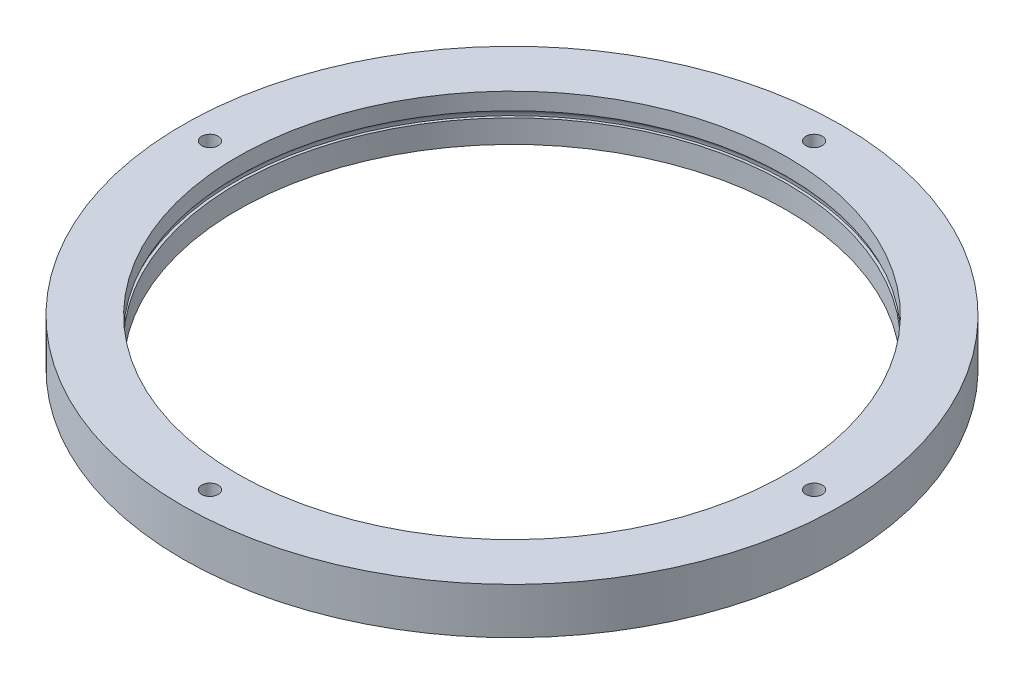
ISO-10303-21;
HEADER;
FILE_DESCRIPTION(('STEP AP214'),'2;1');
FILE_NAME('part.step','',(''),(''),'','','');
FILE_SCHEMA(('AUTOMOTIVE_DESIGN { 1 0 10303 214 1 1 1 1 }'));
ENDSEC;
DATA;
#1=APPLICATION_CONTEXT('core data for automotive mechanical design processes');
#2=APPLICATION_PROTOCOL_DEFINITION('international standard','automotive_design',2000,#1);
#3=PRODUCT_CONTEXT('',#1,'mechanical');
#4=PRODUCT('Part','Part','',(#3));
#5=PRODUCT_RELATED_PRODUCT_CATEGORY('part','',(#4));
#6=PRODUCT_DEFINITION_FORMATION('','',#4);
#7=PRODUCT_DEFINITION_CONTEXT('part definition',#1,'design');
#8=PRODUCT_DEFINITION('design','',#6,#7);
#9=PRODUCT_DEFINITION_SHAPE('','',#8);
#10=(LENGTH_UNIT() NAMED_UNIT(*) SI_UNIT(.MILLI.,.METRE.));
#11=(NAMED_UNIT(*) PLANE_ANGLE_UNIT() SI_UNIT($,.RADIAN.));
#12=(NAMED_UNIT(*) SI_UNIT($,.STERADIAN.) SOLID_ANGLE_UNIT());
#13=UNCERTAINTY_MEASURE_WITH_UNIT(LENGTH_MEASURE(1.E-05),#10,'distance_accuracy_value','');
#14=(GEOMETRIC_REPRESENTATION_CONTEXT(3) GLOBAL_UNCERTAINTY_ASSIGNED_CONTEXT((#13)) GLOBAL_UNIT_ASSIGNED_CONTEXT((#10,
#11,#12)) REPRESENTATION_CONTEXT('',''));
#15=CARTESIAN_POINT('',(0.,0.,0.));
#16=DIRECTION('',(0.,0.,1.));
#17=DIRECTION('',(1.,0.,0.));
#18=AXIS2_PLACEMENT_3D('',#15,#16,#17);
#19=CARTESIAN_POINT('',(0.,8.4,0.));
#20=DIRECTION('',(0.,-1.,0.));
#21=DIRECTION('',(0.,0.,-1.));
#22=AXIS2_PLACEMENT_3D('',#19,#20,#21);
#23=CYLINDRICAL_SURFACE('',#22,50.);
#24=CARTESIAN_POINT('',(0.,8.4,0.));
#25=DIRECTION('',(0.,1.,0.));
#26=DIRECTION('',(0.,0.,1.));
#27=AXIS2_PLACEMENT_3D('',#24,#25,#26);
#28=CIRCLE('',#27,50.);
#29=CARTESIAN_POINT('',(0.,8.4,50.));
#30=VERTEX_POINT('',#29);
#31=EDGE_CURVE('E64',#30,#30,#28,.T.);
#32=ORIENTED_EDGE('',*,*,#31,.T.);
#33=EDGE_LOOP('',(#32));
#34=FACE_BOUND('',#33,.T.);
#35=CARTESIAN_POINT('',(0.,5.30297838823083,0.));
#36=DIRECTION('',(0.,1.,0.));
#37=DIRECTION('',(0.,0.,1.));
#38=AXIS2_PLACEMENT_3D('',#35,#36,#37);
#39=CIRCLE('',#38,50.);
#40=CARTESIAN_POINT('',(0.,5.30297838823083,50.));
#41=VERTEX_POINT('',#40);
#42=EDGE_CURVE('E85',#41,#41,#39,.T.);
#43=ORIENTED_EDGE('',*,*,#42,.F.);
#44=EDGE_LOOP('',(#43));
#45=FACE_BOUND('',#44,.T.);
#46=ADVANCED_FACE('F51',(#34,#45),#23,.F.);
#47=CARTESIAN_POINT('',(0.,8.4,0.));
#48=DIRECTION('',(0.,1.,0.));
#49=DIRECTION('',(0.,0.,1.));
#50=AXIS2_PLACEMENT_3D('',#47,#48,#49);
#51=PLANE('',#50);
#52=CARTESIAN_POINT('',(0.,8.4,-55.));
#53=DIRECTION('',(0.,1.,0.));
#54=DIRECTION('',(0.,0.,1.));
#55=AXIS2_PLACEMENT_3D('',#52,#53,#54);
#56=CIRCLE('',#55,1.5);
#57=CARTESIAN_POINT('',(0.,8.4,-53.5));
#58=VERTEX_POINT('',#57);
#59=EDGE_CURVE('E78',#58,#58,#56,.T.);
#60=ORIENTED_EDGE('',*,*,#59,.F.);
#61=EDGE_LOOP('',(#60));
#62=FACE_BOUND('',#61,.T.);
#63=CARTESIAN_POINT('',(55.,8.4,0.));
#64=DIRECTION('',(0.,1.,0.));
#65=DIRECTION('',(0.,0.,1.));
#66=AXIS2_PLACEMENT_3D('',#63,#64,#65);
#67=CIRCLE('',#66,1.5);
#68=CARTESIAN_POINT('',(55.,8.4,1.5));
#69=VERTEX_POINT('',#68);
#70=EDGE_CURVE('E135',#69,#69,#67,.T.);
#71=ORIENTED_EDGE('',*,*,#70,.F.);
#72=EDGE_LOOP('',(#71));
#73=FACE_BOUND('',#72,.T.);
#74=CARTESIAN_POINT('',(-55.,8.4,0.));
#75=DIRECTION('',(0.,1.,0.));
#76=DIRECTION('',(0.,0.,1.));
#77=AXIS2_PLACEMENT_3D('',#74,#75,#76);
#78=CIRCLE('',#77,1.5);
#79=CARTESIAN_POINT('',(-55.,8.4,1.5));
#80=VERTEX_POINT('',#79);
#81=EDGE_CURVE('E139',#80,#80,#78,.T.);
#82=ORIENTED_EDGE('',*,*,#81,.F.);
#83=EDGE_LOOP('',(#82));
#84=FACE_BOUND('',#83,.T.);
#85=CARTESIAN_POINT('',(0.,8.4,55.));
#86=DIRECTION('',(0.,1.,0.));
#87=DIRECTION('',(0.,0.,1.));
#88=AXIS2_PLACEMENT_3D('',#85,#86,#87);
#89=CIRCLE('',#88,1.5);
#90=CARTESIAN_POINT('',(0.,8.4,56.5));
#91=VERTEX_POINT('',#90);
#92=EDGE_CURVE('E95',#91,#91,#89,.T.);
#93=ORIENTED_EDGE('',*,*,#92,.F.);
#94=EDGE_LOOP('',(#93));
#95=FACE_BOUND('',#94,.T.);
#96=CARTESIAN_POINT('',(0.,8.4,0.));
#97=DIRECTION('',(0.,1.,0.));
#98=DIRECTION('',(0.,0.,1.));
#99=AXIS2_PLACEMENT_3D('',#96,#97,#98);
#100=CIRCLE('',#99,60.);
#101=CARTESIAN_POINT('',(0.,8.4,60.));
#102=VERTEX_POINT('',#101);
#103=EDGE_CURVE('E14',#102,#102,#100,.T.);
#104=ORIENTED_EDGE('',*,*,#103,.T.);
#105=EDGE_LOOP('',(#104));
#106=FACE_BOUND('',#105,.T.);
#107=ORIENTED_EDGE('',*,*,#31,.F.);
#108=EDGE_LOOP('',(#107));
#109=FACE_BOUND('',#108,.T.);
#110=ADVANCED_FACE('F120',(#62,#73,#84,#95,#106,#109),#51,.T.);
#111=CARTESIAN_POINT('',(0.,0.,0.));
#112=DIRECTION('',(0.,1.,0.));
#113=DIRECTION('',(0.,0.,1.));
#114=AXIS2_PLACEMENT_3D('',#111,#112,#113);
#115=PLANE('',#114);
#116=CARTESIAN_POINT('',(0.,0.,-55.));
#117=DIRECTION('',(0.,1.,0.));
#118=DIRECTION('',(0.,0.,1.));
#119=AXIS2_PLACEMENT_3D('',#116,#117,#118);
#120=CIRCLE('',#119,1.5);
#121=CARTESIAN_POINT('',(0.,0.,-53.5));
#122=VERTEX_POINT('',#121);
#123=EDGE_CURVE('E55',#122,#122,#120,.T.);
#124=ORIENTED_EDGE('',*,*,#123,.T.);
#125=EDGE_LOOP('',(#124));
#126=FACE_BOUND('',#125,.T.);
#127=CARTESIAN_POINT('',(55.,0.,0.));
#128=DIRECTION('',(0.,1.,0.));
#129=DIRECTION('',(0.,0.,1.));
#130=AXIS2_PLACEMENT_3D('',#127,#128,#129);
#131=CIRCLE('',#130,1.5);
#132=CARTESIAN_POINT('',(55.,0.,1.5));
#133=VERTEX_POINT('',#132);
#134=EDGE_CURVE('E80',#133,#133,#131,.T.);
#135=ORIENTED_EDGE('',*,*,#134,.T.);
#136=EDGE_LOOP('',(#135));
#137=FACE_BOUND('',#136,.T.);
#138=CARTESIAN_POINT('',(-55.,0.,0.));
#139=DIRECTION('',(0.,1.,0.));
#140=DIRECTION('',(0.,0.,1.));
#141=AXIS2_PLACEMENT_3D('',#138,#139,#140);
#142=CIRCLE('',#141,1.5);
#143=CARTESIAN_POINT('',(-55.,0.,1.5));
#144=VERTEX_POINT('',#143);
#145=EDGE_CURVE('E77',#144,#144,#142,.T.);
#146=ORIENTED_EDGE('',*,*,#145,.T.);
#147=EDGE_LOOP('',(#146));
#148=FACE_BOUND('',#147,.T.);
#149=CARTESIAN_POINT('',(0.,0.,55.));
#150=DIRECTION('',(0.,1.,0.));
#151=DIRECTION('',(0.,0.,1.));
#152=AXIS2_PLACEMENT_3D('',#149,#150,#151);
#153=CIRCLE('',#152,1.5);
#154=CARTESIAN_POINT('',(0.,0.,56.5));
#155=VERTEX_POINT('',#154);
#156=EDGE_CURVE('E74',#155,#155,#153,.T.);
#157=ORIENTED_EDGE('',*,*,#156,.T.);
#158=EDGE_LOOP('',(#157));
#159=FACE_BOUND('',#158,.T.);
#160=CARTESIAN_POINT('',(0.,0.,0.));
#161=DIRECTION('',(0.,1.,0.));
#162=DIRECTION('',(0.,0.,1.));
#163=AXIS2_PLACEMENT_3D('',#160,#161,#162);
#164=CIRCLE('',#163,60.);
#165=CARTESIAN_POINT('',(0.,0.,60.));
#166=VERTEX_POINT('',#165);
#167=EDGE_CURVE('E59',#166,#166,#164,.T.);
#168=ORIENTED_EDGE('',*,*,#167,.F.);
#169=EDGE_LOOP('',(#168));
#170=FACE_BOUND('',#169,.T.);
#171=CARTESIAN_POINT('',(0.,0.,0.));
#172=DIRECTION('',(0.,1.,0.));
#173=DIRECTION('',(0.,0.,1.));
#174=AXIS2_PLACEMENT_3D('',#171,#172,#173);
#175=CIRCLE('',#174,50.);
#176=CARTESIAN_POINT('',(0.,0.,50.));
#177=VERTEX_POINT('',#176);
#178=EDGE_CURVE('E67',#177,#177,#175,.T.);
#179=ORIENTED_EDGE('',*,*,#178,.T.);
#180=EDGE_LOOP('',(#179));
#181=FACE_BOUND('',#180,.T.);
#182=ADVANCED_FACE('F103',(#126,#137,#148,#159,#170,#181),#115,.F.);
#183=CARTESIAN_POINT('',(0.,8.4,0.));
#184=DIRECTION('',(0.,-1.,0.));
#185=DIRECTION('',(0.,0.,-1.));
#186=AXIS2_PLACEMENT_3D('',#183,#184,#185);
#187=CYLINDRICAL_SURFACE('',#186,60.);
#188=ORIENTED_EDGE('',*,*,#103,.F.);
#189=EDGE_LOOP('',(#188));
#190=FACE_BOUND('',#189,.T.);
#191=ORIENTED_EDGE('',*,*,#167,.T.);
#192=EDGE_LOOP('',(#191));
#193=FACE_BOUND('',#192,.T.);
#194=ADVANCED_FACE('F53',(#190,#193),#187,.T.);
#195=CARTESIAN_POINT('',(0.,4.18494439948093,0.));
#196=DIRECTION('',(0.,-1.,0.));
#197=DIRECTION('',(0.,0.,-1.));
#198=AXIS2_PLACEMENT_3D('',#195,#196,#197);
#199=CIRCLE('',#198,50.);
#200=CARTESIAN_POINT('',(0.,4.18494439948093,-50.));
#201=VERTEX_POINT('',#200);
#202=EDGE_CURVE('E70',#201,#201,#199,.T.);
#203=ORIENTED_EDGE('',*,*,#202,.F.);
#204=EDGE_LOOP('',(#203));
#205=FACE_BOUND('',#204,.T.);
#206=ORIENTED_EDGE('',*,*,#178,.F.);
#207=EDGE_LOOP('',(#206));
#208=FACE_BOUND('',#207,.T.);
#209=ADVANCED_FACE('F105',(#205,#208),#23,.F.);
#210=CARTESIAN_POINT('',(0.,4.18494439948093,0.));
#211=DIRECTION('',(0.,1.,0.));
#212=DIRECTION('',(0.,0.,1.));
#213=AXIS2_PLACEMENT_3D('',#210,#211,#212);
#214=TOROIDAL_SURFACE('',#213,49.,1.5);
#215=ORIENTED_EDGE('',*,*,#42,.T.);
#216=EDGE_LOOP('',(#215));
#217=FACE_BOUND('',#216,.T.);
#218=CARTESIAN_POINT('',(0.,4.18494439948093,0.));
#219=DIRECTION('',(0.,1.,0.));
#220=DIRECTION('',(0.,0.,1.));
#221=AXIS2_PLACEMENT_3D('',#218,#219,#220);
#222=CIRCLE('',#221,50.5);
#223=CARTESIAN_POINT('',(0.,4.18494439948093,50.5));
#224=VERTEX_POINT('',#223);
#225=EDGE_CURVE('E73',#224,#224,#222,.T.);
#226=ORIENTED_EDGE('',*,*,#225,.F.);
#227=EDGE_LOOP('',(#226));
#228=FACE_BOUND('',#227,.T.);
#229=ADVANCED_FACE('F107',(#217,#228),#214,.F.);
#230=CARTESIAN_POINT('',(0.,4.18494439948093,0.));
#231=DIRECTION('',(0.,-1.,0.));
#232=DIRECTION('',(0.,0.,-1.));
#233=AXIS2_PLACEMENT_3D('',#230,#231,#232);
#234=PLANE('',#233);
#235=ORIENTED_EDGE('',*,*,#202,.T.);
#236=EDGE_LOOP('',(#235));
#237=FACE_BOUND('',#236,.T.);
#238=ORIENTED_EDGE('',*,*,#225,.T.);
#239=EDGE_LOOP('',(#238));
#240=FACE_BOUND('',#239,.T.);
#241=ADVANCED_FACE('F114',(#237,#240),#234,.F.);
#242=CARTESIAN_POINT('',(0.,-1.6,55.));
#243=DIRECTION('',(0.,1.,0.));
#244=DIRECTION('',(0.,0.,1.));
#245=AXIS2_PLACEMENT_3D('',#242,#243,#244);
#246=CYLINDRICAL_SURFACE('',#245,1.5);
#247=ORIENTED_EDGE('',*,*,#92,.T.);
#248=EDGE_LOOP('',(#247));
#249=FACE_BOUND('',#248,.T.);
#250=ORIENTED_EDGE('',*,*,#156,.F.);
#251=EDGE_LOOP('',(#250));
#252=FACE_BOUND('',#251,.T.);
#253=ADVANCED_FACE('F162',(#249,#252),#246,.F.);
#254=CARTESIAN_POINT('',(-55.,-1.6,0.));
#255=DIRECTION('',(0.,1.,0.));
#256=DIRECTION('',(0.,0.,1.));
#257=AXIS2_PLACEMENT_3D('',#254,#255,#256);
#258=CYLINDRICAL_SURFACE('',#257,1.5);
#259=ORIENTED_EDGE('',*,*,#81,.T.);
#260=EDGE_LOOP('',(#259));
#261=FACE_BOUND('',#260,.T.);
#262=ORIENTED_EDGE('',*,*,#145,.F.);
#263=EDGE_LOOP('',(#262));
#264=FACE_BOUND('',#263,.T.);
#265=ADVANCED_FACE('F156',(#261,#264),#258,.F.);
#266=CARTESIAN_POINT('',(55.,-1.6,0.));
#267=DIRECTION('',(0.,1.,0.));
#268=DIRECTION('',(0.,0.,1.));
#269=AXIS2_PLACEMENT_3D('',#266,#267,#268);
#270=CYLINDRICAL_SURFACE('',#269,1.5);
#271=ORIENTED_EDGE('',*,*,#70,.T.);
#272=EDGE_LOOP('',(#271));
#273=FACE_BOUND('',#272,.T.);
#274=ORIENTED_EDGE('',*,*,#134,.F.);
#275=EDGE_LOOP('',(#274));
#276=FACE_BOUND('',#275,.T.);
#277=ADVANCED_FACE('F151',(#273,#276),#270,.F.);
#278=CARTESIAN_POINT('',(0.,-1.6,-55.));
#279=DIRECTION('',(0.,1.,0.));
#280=DIRECTION('',(0.,0.,1.));
#281=AXIS2_PLACEMENT_3D('',#278,#279,#280);
#282=CYLINDRICAL_SURFACE('',#281,1.5);
#283=ORIENTED_EDGE('',*,*,#59,.T.);
#284=EDGE_LOOP('',(#283));
#285=FACE_BOUND('',#284,.T.);
#286=ORIENTED_EDGE('',*,*,#123,.F.);
#287=EDGE_LOOP('',(#286));
#288=FACE_BOUND('',#287,.T.);
#289=ADVANCED_FACE('F148',(#285,#288),#282,.F.);
#290=CLOSED_SHELL('',(#46,#110,#182,#194,#209,#229,#241,#253,#265,#277,#289));
#291=MANIFOLD_SOLID_BREP('B2',#290);
#292=ADVANCED_BREP_SHAPE_REPRESENTATION('',(#18,#291),#14);
#293=SHAPE_DEFINITION_REPRESENTATION(#9,#292);
ENDSEC;
END-ISO-10303-21;
